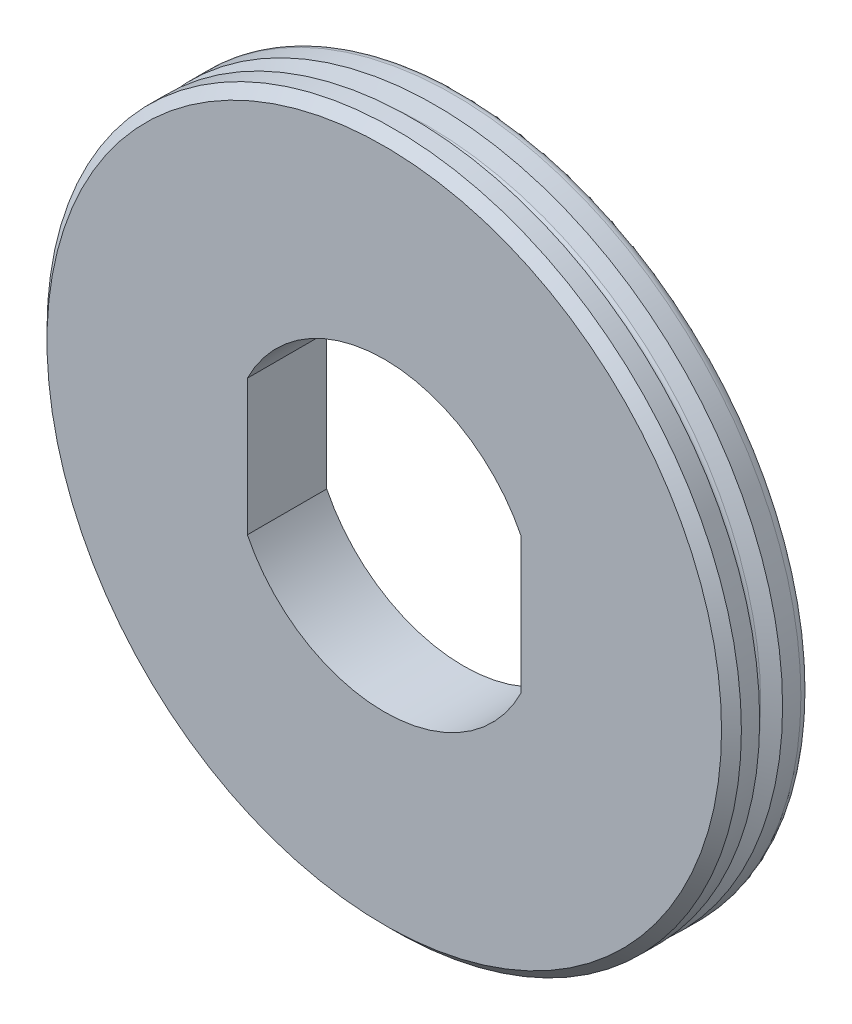
ISO-10303-21;
HEADER;
FILE_DESCRIPTION(('STEP AP214'),'2;1');
FILE_NAME('part.step','',(''),(''),'','','');
FILE_SCHEMA(('AUTOMOTIVE_DESIGN { 1 0 10303 214 1 1 1 1 }'));
ENDSEC;
DATA;
#1=APPLICATION_CONTEXT('core data for automotive mechanical design processes');
#2=APPLICATION_PROTOCOL_DEFINITION('international standard','automotive_design',2000,#1);
#3=PRODUCT_CONTEXT('',#1,'mechanical');
#4=PRODUCT('Part','Part','',(#3));
#5=PRODUCT_RELATED_PRODUCT_CATEGORY('part','',(#4));
#6=PRODUCT_DEFINITION_FORMATION('','',#4);
#7=PRODUCT_DEFINITION_CONTEXT('part definition',#1,'design');
#8=PRODUCT_DEFINITION('design','',#6,#7);
#9=PRODUCT_DEFINITION_SHAPE('','',#8);
#10=(LENGTH_UNIT() NAMED_UNIT(*) SI_UNIT(.MILLI.,.METRE.));
#11=(NAMED_UNIT(*) PLANE_ANGLE_UNIT() SI_UNIT($,.RADIAN.));
#12=(NAMED_UNIT(*) SI_UNIT($,.STERADIAN.) SOLID_ANGLE_UNIT());
#13=UNCERTAINTY_MEASURE_WITH_UNIT(LENGTH_MEASURE(1.E-05),#10,'distance_accuracy_value','');
#14=(GEOMETRIC_REPRESENTATION_CONTEXT(3) GLOBAL_UNCERTAINTY_ASSIGNED_CONTEXT((#13)) GLOBAL_UNIT_ASSIGNED_CONTEXT((#10,
#11,#12)) REPRESENTATION_CONTEXT('',''));
#15=CARTESIAN_POINT('',(0.,0.,0.));
#16=DIRECTION('',(0.,0.,1.));
#17=DIRECTION('',(1.,0.,0.));
#18=AXIS2_PLACEMENT_3D('',#15,#16,#17);
#19=CARTESIAN_POINT('',(0.,0.,2.));
#20=DIRECTION('',(0.,0.,-1.));
#21=DIRECTION('',(-1.,0.,0.));
#22=AXIS2_PLACEMENT_3D('',#19,#20,#21);
#23=CYLINDRICAL_SURFACE('',#22,17.5);
#24=CARTESIAN_POINT('',(0.,0.,1.5));
#25=DIRECTION('',(0.,0.,1.));
#26=DIRECTION('',(1.,0.,0.));
#27=AXIS2_PLACEMENT_3D('',#24,#25,#26);
#28=CIRCLE('',#27,17.5);
#29=CARTESIAN_POINT('',(17.5,0.,1.5));
#30=VERTEX_POINT('',#29);
#31=EDGE_CURVE('E124',#30,#30,#28,.F.);
#32=ORIENTED_EDGE('',*,*,#31,.T.);
#33=EDGE_LOOP('',(#32));
#34=FACE_BOUND('',#33,.T.);
#35=CARTESIAN_POINT('',(0.,0.,0.577350269189624));
#36=DIRECTION('',(0.,0.,1.));
#37=DIRECTION('',(1.,0.,0.));
#38=AXIS2_PLACEMENT_3D('',#35,#36,#37);
#39=CIRCLE('',#38,17.5);
#40=CARTESIAN_POINT('',(17.5,0.,0.577350269189624));
#41=VERTEX_POINT('',#40);
#42=EDGE_CURVE('E112',#41,#41,#39,.T.);
#43=ORIENTED_EDGE('',*,*,#42,.T.);
#44=EDGE_LOOP('',(#43));
#45=FACE_BOUND('',#44,.T.);
#46=ADVANCED_FACE('F42',(#34,#45),#23,.T.);
#47=CARTESIAN_POINT('',(0.,0.,-1.5));
#48=DIRECTION('',(0.,0.,1.));
#49=DIRECTION('',(1.,0.,0.));
#50=AXIS2_PLACEMENT_3D('',#47,#48,#49);
#51=CIRCLE('',#50,17.5);
#52=CARTESIAN_POINT('',(17.5,0.,-1.5));
#53=VERTEX_POINT('',#52);
#54=EDGE_CURVE('E127',#53,#53,#51,.T.);
#55=ORIENTED_EDGE('',*,*,#54,.T.);
#56=EDGE_LOOP('',(#55));
#57=FACE_BOUND('',#56,.T.);
#58=CARTESIAN_POINT('',(0.,0.,-0.577350269189624));
#59=DIRECTION('',(0.,0.,1.));
#60=DIRECTION('',(1.,0.,0.));
#61=AXIS2_PLACEMENT_3D('',#58,#59,#60);
#62=CIRCLE('',#61,17.5);
#63=CARTESIAN_POINT('',(17.5,0.,-0.577350269189624));
#64=VERTEX_POINT('',#63);
#65=EDGE_CURVE('E271',#64,#64,#62,.T.);
#66=ORIENTED_EDGE('',*,*,#65,.F.);
#67=EDGE_LOOP('',(#66));
#68=FACE_BOUND('',#67,.T.);
#69=ADVANCED_FACE('F148',(#57,#68),#23,.T.);
#70=CARTESIAN_POINT('',(0.,0.,2.));
#71=DIRECTION('',(0.,0.,1.));
#72=DIRECTION('',(1.,0.,0.));
#73=AXIS2_PLACEMENT_3D('',#70,#71,#72);
#74=PLANE('',#73);
#75=CARTESIAN_POINT('',(0.,0.,2.));
#76=DIRECTION('',(0.,0.,1.));
#77=DIRECTION('',(1.,0.,0.));
#78=AXIS2_PLACEMENT_3D('',#75,#76,#77);
#79=CIRCLE('',#78,17.);
#80=CARTESIAN_POINT('',(17.,0.,2.));
#81=VERTEX_POINT('',#80);
#82=EDGE_CURVE('E99',#81,#81,#79,.T.);
#83=ORIENTED_EDGE('',*,*,#82,.T.);
#84=EDGE_LOOP('',(#83));
#85=FACE_BOUND('',#84,.T.);
#86=DIRECTION('',(0.,-1.,0.));
#87=VECTOR('',#86,1.);
#88=CARTESIAN_POINT('',(-6.9,3.41760149812701,2.));
#89=LINE('',#88,#87);
#90=CARTESIAN_POINT('',(-6.9,3.41760149812701,2.));
#91=VERTEX_POINT('',#90);
#92=CARTESIAN_POINT('',(-6.9,-3.41760149812701,2.));
#93=VERTEX_POINT('',#92);
#94=EDGE_CURVE('E91',#91,#93,#89,.T.);
#95=ORIENTED_EDGE('',*,*,#94,.F.);
#96=CARTESIAN_POINT('',(0.,0.,2.));
#97=DIRECTION('',(0.,0.,1.));
#98=DIRECTION('',(1.,0.,0.));
#99=AXIS2_PLACEMENT_3D('',#96,#97,#98);
#100=CIRCLE('',#99,7.7);
#101=CARTESIAN_POINT('',(6.9,3.41760149812701,2.));
#102=VERTEX_POINT('',#101);
#103=EDGE_CURVE('E83',#102,#91,#100,.T.);
#104=ORIENTED_EDGE('',*,*,#103,.F.);
#105=DIRECTION('',(0.,1.,0.));
#106=VECTOR('',#105,1.);
#107=CARTESIAN_POINT('',(6.9,3.41760149812701,2.));
#108=LINE('',#107,#106);
#109=CARTESIAN_POINT('',(6.9,-3.41760149812701,2.));
#110=VERTEX_POINT('',#109);
#111=EDGE_CURVE('E106',#110,#102,#108,.T.);
#112=ORIENTED_EDGE('',*,*,#111,.F.);
#113=CARTESIAN_POINT('',(0.,0.,2.));
#114=DIRECTION('',(0.,0.,1.));
#115=DIRECTION('',(1.,0.,0.));
#116=AXIS2_PLACEMENT_3D('',#113,#114,#115);
#117=CIRCLE('',#116,7.7);
#118=EDGE_CURVE('E104',#93,#110,#117,.T.);
#119=ORIENTED_EDGE('',*,*,#118,.F.);
#120=EDGE_LOOP('',(#95,#104,#112,#119));
#121=FACE_BOUND('',#120,.T.);
#122=ADVANCED_FACE('F103',(#85,#121),#74,.T.);
#123=CARTESIAN_POINT('',(0.,0.,-2.));
#124=DIRECTION('',(0.,0.,1.));
#125=DIRECTION('',(1.,0.,0.));
#126=AXIS2_PLACEMENT_3D('',#123,#124,#125);
#127=PLANE('',#126);
#128=CARTESIAN_POINT('',(0.,0.,-2.));
#129=DIRECTION('',(0.,0.,1.));
#130=DIRECTION('',(1.,0.,0.));
#131=AXIS2_PLACEMENT_3D('',#128,#129,#130);
#132=CIRCLE('',#131,17.);
#133=CARTESIAN_POINT('',(17.,0.,-2.));
#134=VERTEX_POINT('',#133);
#135=EDGE_CURVE('E130',#134,#134,#132,.F.);
#136=ORIENTED_EDGE('',*,*,#135,.T.);
#137=EDGE_LOOP('',(#136));
#138=FACE_BOUND('',#137,.T.);
#139=CARTESIAN_POINT('',(0.,0.,-2.));
#140=DIRECTION('',(0.,0.,1.));
#141=DIRECTION('',(1.,0.,0.));
#142=AXIS2_PLACEMENT_3D('',#139,#140,#141);
#143=CIRCLE('',#142,7.7);
#144=CARTESIAN_POINT('',(6.9,3.41760149812701,-2.));
#145=VERTEX_POINT('',#144);
#146=CARTESIAN_POINT('',(-6.9,3.41760149812701,-2.));
#147=VERTEX_POINT('',#146);
#148=EDGE_CURVE('E65',#145,#147,#143,.T.);
#149=ORIENTED_EDGE('',*,*,#148,.T.);
#150=DIRECTION('',(0.,-1.,0.));
#151=VECTOR('',#150,1.);
#152=CARTESIAN_POINT('',(-6.9,3.41760149812701,-2.));
#153=LINE('',#152,#151);
#154=CARTESIAN_POINT('',(-6.9,-3.41760149812701,-2.));
#155=VERTEX_POINT('',#154);
#156=EDGE_CURVE('E98',#147,#155,#153,.T.);
#157=ORIENTED_EDGE('',*,*,#156,.T.);
#158=CARTESIAN_POINT('',(0.,0.,-2.));
#159=DIRECTION('',(0.,0.,1.));
#160=DIRECTION('',(1.,0.,0.));
#161=AXIS2_PLACEMENT_3D('',#158,#159,#160);
#162=CIRCLE('',#161,7.7);
#163=CARTESIAN_POINT('',(6.9,-3.41760149812701,-2.));
#164=VERTEX_POINT('',#163);
#165=EDGE_CURVE('E114',#155,#164,#162,.T.);
#166=ORIENTED_EDGE('',*,*,#165,.T.);
#167=DIRECTION('',(0.,1.,0.));
#168=VECTOR('',#167,1.);
#169=CARTESIAN_POINT('',(6.9,3.41760149812701,-2.));
#170=LINE('',#169,#168);
#171=EDGE_CURVE('E92',#164,#145,#170,.T.);
#172=ORIENTED_EDGE('',*,*,#171,.T.);
#173=EDGE_LOOP('',(#149,#157,#166,#172));
#174=FACE_BOUND('',#173,.T.);
#175=ADVANCED_FACE('F158',(#138,#174),#127,.F.);
#176=CARTESIAN_POINT('',(0.,0.,2.));
#177=DIRECTION('',(0.,0.,-1.));
#178=DIRECTION('',(-1.,0.,0.));
#179=AXIS2_PLACEMENT_3D('',#176,#177,#178);
#180=CYLINDRICAL_SURFACE('',#179,7.7);
#181=ORIENTED_EDGE('',*,*,#148,.F.);
#182=DIRECTION('',(0.,0.,-1.));
#183=VECTOR('',#182,1.);
#184=CARTESIAN_POINT('',(6.9,3.41760149812701,2.));
#185=LINE('',#184,#183);
#186=EDGE_CURVE('E87',#102,#145,#185,.T.);
#187=ORIENTED_EDGE('',*,*,#186,.F.);
#188=ORIENTED_EDGE('',*,*,#103,.T.);
#189=DIRECTION('',(0.,0.,-1.));
#190=VECTOR('',#189,1.);
#191=CARTESIAN_POINT('',(-6.9,3.41760149812701,2.));
#192=LINE('',#191,#190);
#193=EDGE_CURVE('E86',#91,#147,#192,.T.);
#194=ORIENTED_EDGE('',*,*,#193,.T.);
#195=EDGE_LOOP('',(#181,#187,#188,#194));
#196=FACE_BOUND('',#195,.T.);
#197=ADVANCED_FACE('F85',(#196),#180,.F.);
#198=CARTESIAN_POINT('',(-6.9,3.41760149812701,2.));
#199=DIRECTION('',(1.,0.,0.));
#200=DIRECTION('',(0.,1.,0.));
#201=AXIS2_PLACEMENT_3D('',#198,#199,#200);
#202=PLANE('',#201);
#203=ORIENTED_EDGE('',*,*,#156,.F.);
#204=ORIENTED_EDGE('',*,*,#193,.F.);
#205=ORIENTED_EDGE('',*,*,#94,.T.);
#206=DIRECTION('',(0.,0.,-1.));
#207=VECTOR('',#206,1.);
#208=CARTESIAN_POINT('',(-6.9,-3.41760149812701,2.));
#209=LINE('',#208,#207);
#210=EDGE_CURVE('E100',#93,#155,#209,.T.);
#211=ORIENTED_EDGE('',*,*,#210,.T.);
#212=EDGE_LOOP('',(#203,#204,#205,#211));
#213=FACE_BOUND('',#212,.T.);
#214=ADVANCED_FACE('F95',(#213),#202,.T.);
#215=CARTESIAN_POINT('',(0.,0.,2.));
#216=DIRECTION('',(0.,0.,-1.));
#217=DIRECTION('',(-1.,0.,0.));
#218=AXIS2_PLACEMENT_3D('',#215,#216,#217);
#219=CYLINDRICAL_SURFACE('',#218,7.7);
#220=ORIENTED_EDGE('',*,*,#165,.F.);
#221=ORIENTED_EDGE('',*,*,#210,.F.);
#222=ORIENTED_EDGE('',*,*,#118,.T.);
#223=DIRECTION('',(0.,0.,-1.));
#224=VECTOR('',#223,1.);
#225=CARTESIAN_POINT('',(6.9,-3.41760149812701,2.));
#226=LINE('',#225,#224);
#227=EDGE_CURVE('E57',#110,#164,#226,.T.);
#228=ORIENTED_EDGE('',*,*,#227,.T.);
#229=EDGE_LOOP('',(#220,#221,#222,#228));
#230=FACE_BOUND('',#229,.T.);
#231=ADVANCED_FACE('F185',(#230),#219,.F.);
#232=CARTESIAN_POINT('',(6.9,3.41760149812701,2.));
#233=DIRECTION('',(-1.,0.,0.));
#234=DIRECTION('',(0.,0.,1.));
#235=AXIS2_PLACEMENT_3D('',#232,#233,#234);
#236=PLANE('',#235);
#237=ORIENTED_EDGE('',*,*,#171,.F.);
#238=ORIENTED_EDGE('',*,*,#227,.F.);
#239=ORIENTED_EDGE('',*,*,#111,.T.);
#240=ORIENTED_EDGE('',*,*,#186,.T.);
#241=EDGE_LOOP('',(#237,#238,#239,#240));
#242=FACE_BOUND('',#241,.T.);
#243=ADVANCED_FACE('F188',(#242),#236,.T.);
#244=CARTESIAN_POINT('',(0.,0.,0.577350269189624));
#245=DIRECTION('',(0.,0.,1.));
#246=DIRECTION('',(1.,0.,0.));
#247=AXIS2_PLACEMENT_3D('',#244,#245,#246);
#248=CONICAL_SURFACE('',#247,17.5,1.0471975511966);
#249=CARTESIAN_POINT('',(0.,0.,0.17320508075689));
#250=DIRECTION('',(0.,0.,1.));
#251=DIRECTION('',(1.,0.,0.));
#252=AXIS2_PLACEMENT_3D('',#249,#250,#251);
#253=CIRCLE('',#252,16.8);
#254=CARTESIAN_POINT('',(16.8,0.,0.17320508075689));
#255=VERTEX_POINT('',#254);
#256=EDGE_CURVE('E50',#255,#255,#253,.T.);
#257=ORIENTED_EDGE('',*,*,#256,.T.);
#258=EDGE_LOOP('',(#257));
#259=FACE_BOUND('',#258,.T.);
#260=ORIENTED_EDGE('',*,*,#42,.F.);
#261=EDGE_LOOP('',(#260));
#262=FACE_BOUND('',#261,.T.);
#263=ADVANCED_FACE('F135',(#259,#262),#248,.T.);
#264=CARTESIAN_POINT('',(0.,0.,0.));
#265=DIRECTION('',(0.,0.,-1.));
#266=DIRECTION('',(-1.,0.,0.));
#267=AXIS2_PLACEMENT_3D('',#264,#265,#266);
#268=CONICAL_SURFACE('',#267,16.5,1.0471975511966);
#269=CARTESIAN_POINT('',(0.,0.,-0.17320508075689));
#270=DIRECTION('',(0.,0.,-1.));
#271=DIRECTION('',(-1.,0.,0.));
#272=AXIS2_PLACEMENT_3D('',#269,#270,#271);
#273=CIRCLE('',#272,16.8);
#274=CARTESIAN_POINT('',(-16.8,0.,-0.17320508075689));
#275=VERTEX_POINT('',#274);
#276=EDGE_CURVE('E11',#275,#275,#273,.T.);
#277=ORIENTED_EDGE('',*,*,#276,.T.);
#278=EDGE_LOOP('',(#277));
#279=FACE_BOUND('',#278,.T.);
#280=ORIENTED_EDGE('',*,*,#65,.T.);
#281=EDGE_LOOP('',(#280));
#282=FACE_BOUND('',#281,.T.);
#283=ADVANCED_FACE('F164',(#279,#282),#268,.T.);
#284=CARTESIAN_POINT('',(0.,0.,2.));
#285=DIRECTION('',(0.,0.,-1.));
#286=DIRECTION('',(-1.,0.,0.));
#287=AXIS2_PLACEMENT_3D('',#284,#285,#286);
#288=CONICAL_SURFACE('',#287,17.,0.785398163397448);
#289=ORIENTED_EDGE('',*,*,#31,.F.);
#290=EDGE_LOOP('',(#289));
#291=FACE_BOUND('',#290,.T.);
#292=ORIENTED_EDGE('',*,*,#82,.F.);
#293=EDGE_LOOP('',(#292));
#294=FACE_BOUND('',#293,.T.);
#295=ADVANCED_FACE('F144',(#291,#294),#288,.T.);
#296=CARTESIAN_POINT('',(0.,0.,-1.5));
#297=DIRECTION('',(0.,0.,1.));
#298=DIRECTION('',(1.,0.,0.));
#299=AXIS2_PLACEMENT_3D('',#296,#297,#298);
#300=TOROIDAL_SURFACE('',#299,17.,0.5);
#301=ORIENTED_EDGE('',*,*,#135,.F.);
#302=EDGE_LOOP('',(#301));
#303=FACE_BOUND('',#302,.T.);
#304=ORIENTED_EDGE('',*,*,#54,.F.);
#305=EDGE_LOOP('',(#304));
#306=FACE_BOUND('',#305,.T.);
#307=ADVANCED_FACE('F139',(#303,#306),#300,.T.);
#308=CARTESIAN_POINT('',(0.,0.,0.));
#309=DIRECTION('',(0.,0.,1.));
#310=DIRECTION('',(1.,0.,0.));
#311=AXIS2_PLACEMENT_3D('',#308,#309,#310);
#312=TOROIDAL_SURFACE('',#311,16.9,0.2);
#313=ORIENTED_EDGE('',*,*,#276,.F.);
#314=EDGE_LOOP('',(#313));
#315=FACE_BOUND('',#314,.T.);
#316=ORIENTED_EDGE('',*,*,#256,.F.);
#317=EDGE_LOOP('',(#316));
#318=FACE_BOUND('',#317,.T.);
#319=ADVANCED_FACE('F44',(#315,#318),#312,.F.);
#320=CLOSED_SHELL('',(#46,#69,#122,#175,#197,#214,#231,#243,#263,#283,#295,#307,#319));
#321=MANIFOLD_SOLID_BREP('B2',#320);
#322=ADVANCED_BREP_SHAPE_REPRESENTATION('',(#18,#321),#14);
#323=SHAPE_DEFINITION_REPRESENTATION(#9,#322);
ENDSEC;
END-ISO-10303-21;
